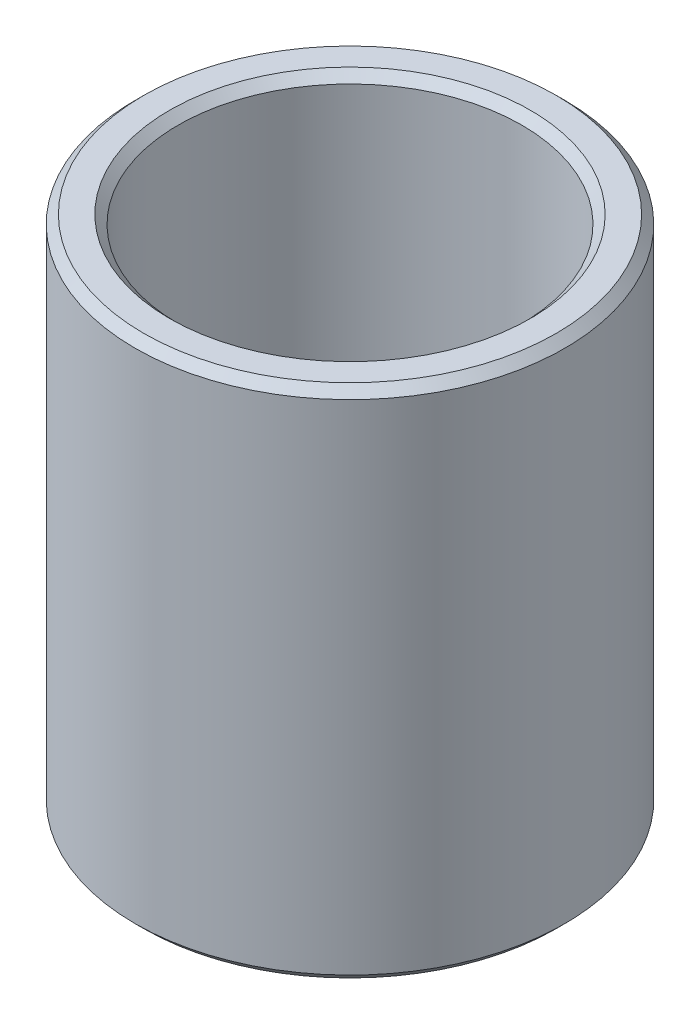
ISO-10303-21;
HEADER;
FILE_DESCRIPTION(('STEP AP214'),'2;1');
FILE_NAME('part.step','',(''),(''),'','','');
FILE_SCHEMA(('AUTOMOTIVE_DESIGN { 1 0 10303 214 1 1 1 1 }'));
ENDSEC;
DATA;
#1=APPLICATION_CONTEXT('core data for automotive mechanical design processes');
#2=APPLICATION_PROTOCOL_DEFINITION('international standard','automotive_design',2000,#1);
#3=PRODUCT_CONTEXT('',#1,'mechanical');
#4=PRODUCT('Part','Part','',(#3));
#5=PRODUCT_RELATED_PRODUCT_CATEGORY('part','',(#4));
#6=PRODUCT_DEFINITION_FORMATION('','',#4);
#7=PRODUCT_DEFINITION_CONTEXT('part definition',#1,'design');
#8=PRODUCT_DEFINITION('design','',#6,#7);
#9=PRODUCT_DEFINITION_SHAPE('','',#8);
#10=(LENGTH_UNIT() NAMED_UNIT(*) SI_UNIT(.MILLI.,.METRE.));
#11=(NAMED_UNIT(*) PLANE_ANGLE_UNIT() SI_UNIT($,.RADIAN.));
#12=(NAMED_UNIT(*) SI_UNIT($,.STERADIAN.) SOLID_ANGLE_UNIT());
#13=UNCERTAINTY_MEASURE_WITH_UNIT(LENGTH_MEASURE(1.E-05),#10,'distance_accuracy_value','');
#14=(GEOMETRIC_REPRESENTATION_CONTEXT(3) GLOBAL_UNCERTAINTY_ASSIGNED_CONTEXT((#13)) GLOBAL_UNIT_ASSIGNED_CONTEXT((#10,
#11,#12)) REPRESENTATION_CONTEXT('',''));
#15=CARTESIAN_POINT('',(0.,0.,0.));
#16=DIRECTION('',(0.,0.,1.));
#17=DIRECTION('',(1.,0.,0.));
#18=AXIS2_PLACEMENT_3D('',#15,#16,#17);
#19=CARTESIAN_POINT('',(0.,0.,0.));
#20=DIRECTION('',(0.,-1.,0.));
#21=DIRECTION('',(0.,0.,-1.));
#22=AXIS2_PLACEMENT_3D('',#19,#20,#21);
#23=CYLINDRICAL_SURFACE('',#22,4.);
#24=CARTESIAN_POINT('',(0.,11.8,0.));
#25=DIRECTION('',(0.,1.,0.));
#26=DIRECTION('',(0.,0.,1.));
#27=AXIS2_PLACEMENT_3D('',#24,#25,#26);
#28=CIRCLE('',#27,4.);
#29=CARTESIAN_POINT('',(0.,11.8,4.));
#30=VERTEX_POINT('',#29);
#31=EDGE_CURVE('E45',#30,#30,#28,.T.);
#32=ORIENTED_EDGE('',*,*,#31,.T.);
#33=EDGE_LOOP('',(#32));
#34=FACE_BOUND('',#33,.T.);
#35=CARTESIAN_POINT('',(0.,0.199999999999999,0.));
#36=DIRECTION('',(0.,-1.,0.));
#37=DIRECTION('',(0.,0.,-1.));
#38=AXIS2_PLACEMENT_3D('',#35,#36,#37);
#39=CIRCLE('',#38,4.);
#40=CARTESIAN_POINT('',(0.,0.199999999999999,-4.));
#41=VERTEX_POINT('',#40);
#42=EDGE_CURVE('E49',#41,#41,#39,.T.);
#43=ORIENTED_EDGE('',*,*,#42,.T.);
#44=EDGE_LOOP('',(#43));
#45=FACE_BOUND('',#44,.T.);
#46=ADVANCED_FACE('F35',(#34,#45),#23,.F.);
#47=CARTESIAN_POINT('',(4.,12.,0.));
#48=DIRECTION('',(0.,1.,0.));
#49=DIRECTION('',(0.,0.,1.));
#50=AXIS2_PLACEMENT_3D('',#47,#48,#49);
#51=PLANE('',#50);
#52=CARTESIAN_POINT('',(0.,12.,0.));
#53=DIRECTION('',(0.,1.,0.));
#54=DIRECTION('',(0.,0.,1.));
#55=AXIS2_PLACEMENT_3D('',#52,#53,#54);
#56=CIRCLE('',#55,4.8);
#57=CARTESIAN_POINT('',(0.,12.,4.8));
#58=VERTEX_POINT('',#57);
#59=EDGE_CURVE('E54',#58,#58,#56,.T.);
#60=ORIENTED_EDGE('',*,*,#59,.T.);
#61=EDGE_LOOP('',(#60));
#62=FACE_BOUND('',#61,.T.);
#63=CARTESIAN_POINT('',(0.,12.,0.));
#64=DIRECTION('',(0.,1.,0.));
#65=DIRECTION('',(0.,0.,1.));
#66=AXIS2_PLACEMENT_3D('',#63,#64,#65);
#67=CIRCLE('',#66,4.2);
#68=CARTESIAN_POINT('',(0.,12.,4.2));
#69=VERTEX_POINT('',#68);
#70=EDGE_CURVE('E57',#69,#69,#67,.F.);
#71=ORIENTED_EDGE('',*,*,#70,.T.);
#72=EDGE_LOOP('',(#71));
#73=FACE_BOUND('',#72,.T.);
#74=ADVANCED_FACE('F85',(#62,#73),#51,.T.);
#75=CARTESIAN_POINT('',(0.,0.,0.));
#76=DIRECTION('',(0.,-1.,0.));
#77=DIRECTION('',(0.,0.,-1.));
#78=AXIS2_PLACEMENT_3D('',#75,#76,#77);
#79=CYLINDRICAL_SURFACE('',#78,5.);
#80=CARTESIAN_POINT('',(0.,11.8,0.));
#81=DIRECTION('',(0.,1.,0.));
#82=DIRECTION('',(0.,0.,1.));
#83=AXIS2_PLACEMENT_3D('',#80,#81,#82);
#84=CIRCLE('',#83,5.);
#85=CARTESIAN_POINT('',(0.,11.8,5.));
#86=VERTEX_POINT('',#85);
#87=EDGE_CURVE('E60',#86,#86,#84,.F.);
#88=ORIENTED_EDGE('',*,*,#87,.T.);
#89=EDGE_LOOP('',(#88));
#90=FACE_BOUND('',#89,.T.);
#91=CARTESIAN_POINT('',(0.,0.2,0.));
#92=DIRECTION('',(0.,-1.,0.));
#93=DIRECTION('',(0.,0.,-1.));
#94=AXIS2_PLACEMENT_3D('',#91,#92,#93);
#95=CIRCLE('',#94,5.);
#96=CARTESIAN_POINT('',(0.,0.2,-5.));
#97=VERTEX_POINT('',#96);
#98=EDGE_CURVE('E63',#97,#97,#95,.F.);
#99=ORIENTED_EDGE('',*,*,#98,.T.);
#100=EDGE_LOOP('',(#99));
#101=FACE_BOUND('',#100,.T.);
#102=ADVANCED_FACE('F67',(#90,#101),#79,.T.);
#103=CARTESIAN_POINT('',(5.,0.,0.));
#104=DIRECTION('',(0.,-1.,0.));
#105=DIRECTION('',(0.,0.,-1.));
#106=AXIS2_PLACEMENT_3D('',#103,#104,#105);
#107=PLANE('',#106);
#108=CARTESIAN_POINT('',(0.,0.,0.));
#109=DIRECTION('',(0.,-1.,0.));
#110=DIRECTION('',(0.,0.,-1.));
#111=AXIS2_PLACEMENT_3D('',#108,#109,#110);
#112=CIRCLE('',#111,4.8);
#113=CARTESIAN_POINT('',(0.,0.,-4.8));
#114=VERTEX_POINT('',#113);
#115=EDGE_CURVE('E10',#114,#114,#112,.T.);
#116=ORIENTED_EDGE('',*,*,#115,.T.);
#117=EDGE_LOOP('',(#116));
#118=FACE_BOUND('',#117,.T.);
#119=CARTESIAN_POINT('',(0.,0.,0.));
#120=DIRECTION('',(0.,-1.,0.));
#121=DIRECTION('',(0.,0.,-1.));
#122=AXIS2_PLACEMENT_3D('',#119,#120,#121);
#123=CIRCLE('',#122,4.2);
#124=CARTESIAN_POINT('',(0.,0.,-4.2));
#125=VERTEX_POINT('',#124);
#126=EDGE_CURVE('E41',#125,#125,#123,.F.);
#127=ORIENTED_EDGE('',*,*,#126,.T.);
#128=EDGE_LOOP('',(#127));
#129=FACE_BOUND('',#128,.T.);
#130=ADVANCED_FACE('F101',(#118,#129),#107,.T.);
#131=CARTESIAN_POINT('',(0.,11.8,0.));
#132=DIRECTION('',(0.,-1.,0.));
#133=DIRECTION('',(0.,0.,-1.));
#134=AXIS2_PLACEMENT_3D('',#131,#132,#133);
#135=CONICAL_SURFACE('',#134,5.,0.785398163397448);
#136=ORIENTED_EDGE('',*,*,#59,.F.);
#137=EDGE_LOOP('',(#136));
#138=FACE_BOUND('',#137,.T.);
#139=ORIENTED_EDGE('',*,*,#87,.F.);
#140=EDGE_LOOP('',(#139));
#141=FACE_BOUND('',#140,.T.);
#142=ADVANCED_FACE('F81',(#138,#141),#135,.T.);
#143=CARTESIAN_POINT('',(0.,12.,0.));
#144=DIRECTION('',(0.,1.,0.));
#145=DIRECTION('',(0.,0.,1.));
#146=AXIS2_PLACEMENT_3D('',#143,#144,#145);
#147=CONICAL_SURFACE('',#146,4.2,0.785398163397444);
#148=ORIENTED_EDGE('',*,*,#31,.F.);
#149=EDGE_LOOP('',(#148));
#150=FACE_BOUND('',#149,.T.);
#151=ORIENTED_EDGE('',*,*,#70,.F.);
#152=EDGE_LOOP('',(#151));
#153=FACE_BOUND('',#152,.T.);
#154=ADVANCED_FACE('F73',(#150,#153),#147,.F.);
#155=CARTESIAN_POINT('',(0.,0.,0.));
#156=DIRECTION('',(0.,1.,0.));
#157=DIRECTION('',(0.,0.,1.));
#158=AXIS2_PLACEMENT_3D('',#155,#156,#157);
#159=CONICAL_SURFACE('',#158,4.8,0.785398163397444);
#160=ORIENTED_EDGE('',*,*,#98,.F.);
#161=EDGE_LOOP('',(#160));
#162=FACE_BOUND('',#161,.T.);
#163=ORIENTED_EDGE('',*,*,#115,.F.);
#164=EDGE_LOOP('',(#163));
#165=FACE_BOUND('',#164,.T.);
#166=ADVANCED_FACE('F69',(#162,#165),#159,.T.);
#167=CARTESIAN_POINT('',(0.,0.199999999999999,0.));
#168=DIRECTION('',(0.,-1.,0.));
#169=DIRECTION('',(0.,0.,-1.));
#170=AXIS2_PLACEMENT_3D('',#167,#168,#169);
#171=CONICAL_SURFACE('',#170,4.,0.785398163397451);
#172=ORIENTED_EDGE('',*,*,#126,.F.);
#173=EDGE_LOOP('',(#172));
#174=FACE_BOUND('',#173,.T.);
#175=ORIENTED_EDGE('',*,*,#42,.F.);
#176=EDGE_LOOP('',(#175));
#177=FACE_BOUND('',#176,.T.);
#178=ADVANCED_FACE('F72',(#174,#177),#171,.F.);
#179=CLOSED_SHELL('',(#46,#74,#102,#130,#142,#154,#166,#178));
#180=MANIFOLD_SOLID_BREP('B2',#179);
#181=ADVANCED_BREP_SHAPE_REPRESENTATION('',(#18,#180),#14);
#182=SHAPE_DEFINITION_REPRESENTATION(#9,#181);
ENDSEC;
END-ISO-10303-21;
